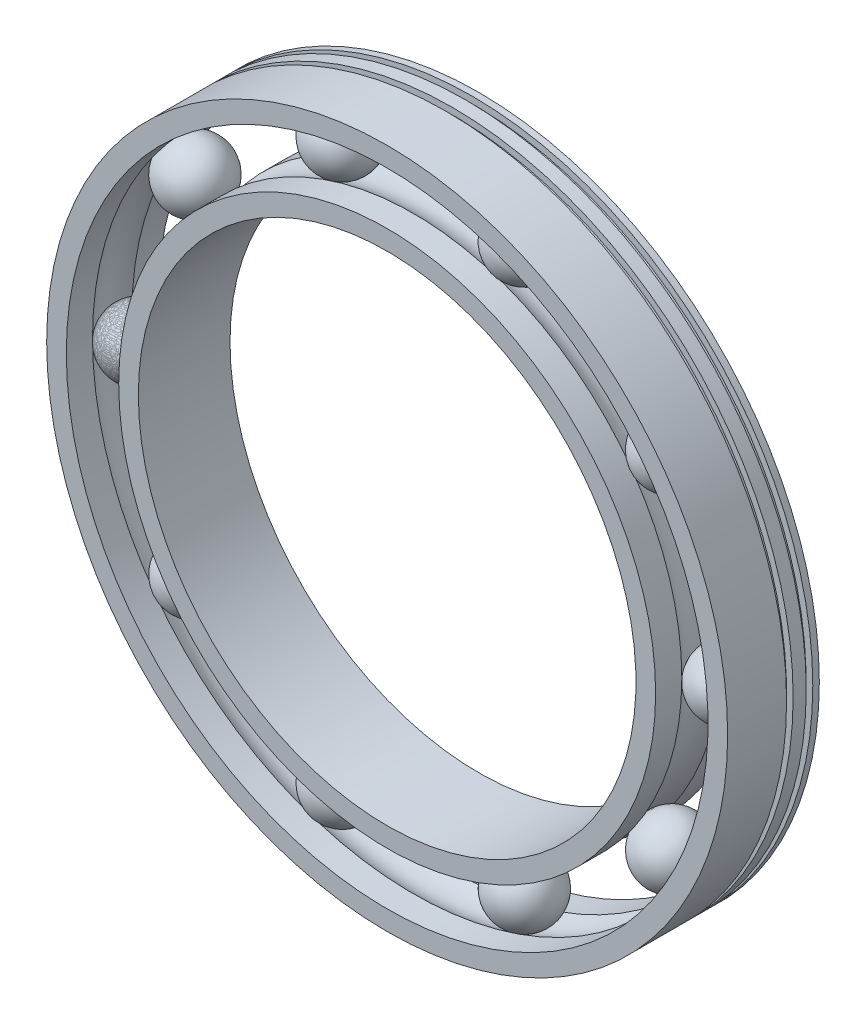
ISO-10303-21;
HEADER;
FILE_DESCRIPTION(('STEP AP214'),'2;1');
FILE_NAME('part.step','',(''),(''),'','','');
FILE_SCHEMA(('AUTOMOTIVE_DESIGN { 1 0 10303 214 1 1 1 1 }'));
ENDSEC;
DATA;
#1=APPLICATION_CONTEXT('core data for automotive mechanical design processes');
#2=APPLICATION_PROTOCOL_DEFINITION('international standard','automotive_design',2000,#1);
#3=PRODUCT_CONTEXT('',#1,'mechanical');
#4=PRODUCT('Part','Part','',(#3));
#5=PRODUCT_RELATED_PRODUCT_CATEGORY('part','',(#4));
#6=PRODUCT_DEFINITION_FORMATION('','',#4);
#7=PRODUCT_DEFINITION_CONTEXT('part definition',#1,'design');
#8=PRODUCT_DEFINITION('design','',#6,#7);
#9=PRODUCT_DEFINITION_SHAPE('','',#8);
#10=(LENGTH_UNIT() NAMED_UNIT(*) SI_UNIT(.MILLI.,.METRE.));
#11=(NAMED_UNIT(*) PLANE_ANGLE_UNIT() SI_UNIT($,.RADIAN.));
#12=(NAMED_UNIT(*) SI_UNIT($,.STERADIAN.) SOLID_ANGLE_UNIT());
#13=UNCERTAINTY_MEASURE_WITH_UNIT(LENGTH_MEASURE(1.E-05),#10,'distance_accuracy_value','');
#14=(GEOMETRIC_REPRESENTATION_CONTEXT(3) GLOBAL_UNCERTAINTY_ASSIGNED_CONTEXT((#13)) GLOBAL_UNIT_ASSIGNED_CONTEXT((#10,
#11,#12)) REPRESENTATION_CONTEXT('',''));
#15=CARTESIAN_POINT('',(0.,0.,0.));
#16=DIRECTION('',(0.,0.,1.));
#17=DIRECTION('',(1.,0.,0.));
#18=AXIS2_PLACEMENT_3D('',#15,#16,#17);
#19=CARTESIAN_POINT('',(-36.405764746873,-26.4503363531608,0.));
#20=DIRECTION('',(0.47552825814757,-0.654508497187483,0.587785252292469));
#21=DIRECTION('',(0.809016994374955,0.587785252292462,0.));
#22=AXIS2_PLACEMENT_3D('',#19,#20,#21);
#23=SPHERICAL_SURFACE('',#22,5.);
#24=CARTESIAN_POINT('',(-34.0281234561351,-29.7228788390982,2.93892626146234));
#25=VERTEX_POINT('',#24);
#26=VERTEX_LOOP('',#25);
#27=FACE_BOUND('',#26,.T.);
#28=ADVANCED_FACE('F39',(#27),#23,.T.);
#29=CLOSED_SHELL('',(#28));
#30=MANIFOLD_SOLID_BREP('B2',#29);
#31=CARTESIAN_POINT('',(-13.9057647468731,-42.7975432332818,0.));
#32=DIRECTION('',(0.769420884293814,-0.25000000000001,0.587785252292469));
#33=DIRECTION('',(0.309016994374958,0.95105651629515,0.));
#34=AXIS2_PLACEMENT_3D('',#31,#32,#33);
#35=SPHERICAL_SURFACE('',#34,5.);
#36=CARTESIAN_POINT('',(-10.0586603254041,-44.0475432332818,2.93892626146234));
#37=VERTEX_POINT('',#36);
#38=VERTEX_LOOP('',#37);
#39=FACE_BOUND('',#38,.T.);
#40=ADVANCED_FACE('F57',(#39),#35,.T.);
#41=CLOSED_SHELL('',(#40));
#42=MANIFOLD_SOLID_BREP('B6',#41);
#43=CARTESIAN_POINT('',(13.9057647468722,-42.797543233282,0.));
#44=DIRECTION('',(0.769420884293819,0.249999999999993,0.587785252292469));
#45=DIRECTION('',(-0.309016994374938,0.951056516295157,0.));
#46=AXIS2_PLACEMENT_3D('',#43,#44,#45);
#47=SPHERICAL_SURFACE('',#46,5.);
#48=CARTESIAN_POINT('',(17.7528691683413,-41.5475432332821,2.93892626146234));
#49=VERTEX_POINT('',#48);
#50=VERTEX_LOOP('',#49);
#51=FACE_BOUND('',#50,.T.);
#52=ADVANCED_FACE('F75',(#51),#47,.T.);
#53=CLOSED_SHELL('',(#52));
#54=MANIFOLD_SOLID_BREP('B35',#53);
#55=CARTESIAN_POINT('',(36.4057647468724,-26.4503363531616,0.));
#56=DIRECTION('',(0.475528258147585,0.654508497187472,0.587785252292469));
#57=DIRECTION('',(-0.809016994374942,0.58778525229248,0.));
#58=AXIS2_PLACEMENT_3D('',#55,#56,#57);
#59=SPHERICAL_SURFACE('',#58,5.);
#60=CARTESIAN_POINT('',(38.7834060376103,-23.1777938672242,2.93892626146234));
#61=VERTEX_POINT('',#60);
#62=VERTEX_LOOP('',#61);
#63=FACE_BOUND('',#62,.T.);
#64=ADVANCED_FACE('F93',(#63),#59,.T.);
#65=CLOSED_SHELL('',(#64));
#66=MANIFOLD_SOLID_BREP('B53',#65);
#67=CARTESIAN_POINT('',(45.,0.,0.));
#68=DIRECTION('',(0.,0.809016994374951,0.587785252292469));
#69=DIRECTION('',(-1.,0.,0.));
#70=AXIS2_PLACEMENT_3D('',#67,#68,#69);
#71=SPHERICAL_SURFACE('',#70,5.);
#72=CARTESIAN_POINT('',(45.,4.04508497187475,2.93892626146234));
#73=VERTEX_POINT('',#72);
#74=VERTEX_LOOP('',#73);
#75=FACE_BOUND('',#74,.T.);
#76=ADVANCED_FACE('F111',(#75),#71,.T.);
#77=CLOSED_SHELL('',(#76));
#78=MANIFOLD_SOLID_BREP('B71',#77);
#79=CARTESIAN_POINT('',(36.4057647468728,26.4503363531611,0.));
#80=DIRECTION('',(-0.475528258147575,0.654508497187479,0.587785252292469));
#81=DIRECTION('',(-0.809016994374951,-0.587785252292468,0.));
#82=AXIS2_PLACEMENT_3D('',#79,#80,#81);
#83=SPHERICAL_SURFACE('',#82,5.);
#84=CARTESIAN_POINT('',(34.0281234561349,29.7228788390985,2.93892626146234));
#85=VERTEX_POINT('',#84);
#86=VERTEX_LOOP('',#85);
#87=FACE_BOUND('',#86,.T.);
#88=ADVANCED_FACE('F129',(#87),#83,.T.);
#89=CLOSED_SHELL('',(#88));
#90=MANIFOLD_SOLID_BREP('B89',#89);
#91=CARTESIAN_POINT('',(13.9057647468728,42.7975432332819,0.));
#92=DIRECTION('',(-0.769420884293815,0.250000000000005,0.587785252292469));
#93=DIRECTION('',(-0.309016994374952,-0.951056516295152,0.));
#94=AXIS2_PLACEMENT_3D('',#91,#92,#93);
#95=SPHERICAL_SURFACE('',#94,5.);
#96=CARTESIAN_POINT('',(10.0586603254037,44.0475432332819,2.93892626146234));
#97=VERTEX_POINT('',#96);
#98=VERTEX_LOOP('',#97);
#99=FACE_BOUND('',#98,.T.);
#100=ADVANCED_FACE('F147',(#99),#95,.T.);
#101=CLOSED_SHELL('',(#100));
#102=MANIFOLD_SOLID_BREP('B107',#101);
#103=CARTESIAN_POINT('',(-13.9057647468725,42.797543233282,0.));
#104=DIRECTION('',(-0.769420884293817,-0.249999999999999,0.587785252292469));
#105=DIRECTION('',(0.309016994374945,-0.951056516295155,0.));
#106=AXIS2_PLACEMENT_3D('',#103,#104,#105);
#107=SPHERICAL_SURFACE('',#106,5.);
#108=CARTESIAN_POINT('',(-17.7528691683416,41.547543233282,2.93892626146234));
#109=VERTEX_POINT('',#108);
#110=VERTEX_LOOP('',#109);
#111=FACE_BOUND('',#110,.T.);
#112=ADVANCED_FACE('F165',(#111),#107,.T.);
#113=CLOSED_SHELL('',(#112));
#114=MANIFOLD_SOLID_BREP('B125',#113);
#115=CARTESIAN_POINT('',(-36.4057647468726,26.4503363531613,0.));
#116=DIRECTION('',(-0.47552825814758,-0.654508497187476,0.587785252292469));
#117=DIRECTION('',(0.809016994374947,-0.587785252292474,0.));
#118=AXIS2_PLACEMENT_3D('',#115,#116,#117);
#119=SPHERICAL_SURFACE('',#118,5.);
#120=CARTESIAN_POINT('',(-38.7834060376105,23.177793867224,2.93892626146234));
#121=VERTEX_POINT('',#120);
#122=VERTEX_LOOP('',#121);
#123=FACE_BOUND('',#122,.T.);
#124=ADVANCED_FACE('F183',(#123),#119,.T.);
#125=CLOSED_SHELL('',(#124));
#126=MANIFOLD_SOLID_BREP('B143',#125);
#127=CARTESIAN_POINT('',(-45.,0.,0.));
#128=DIRECTION('',(0.,0.809016994374955,-0.587785252292462));
#129=DIRECTION('',(1.,0.,0.));
#130=AXIS2_PLACEMENT_3D('',#127,#128,#129);
#131=SPHERICAL_SURFACE('',#130,5.);
#132=CARTESIAN_POINT('',(-45.,4.04508497187478,-2.93892626146231));
#133=VERTEX_POINT('',#132);
#134=VERTEX_LOOP('',#133);
#135=FACE_BOUND('',#134,.T.);
#136=ADVANCED_FACE('F201',(#135),#131,.T.);
#137=CLOSED_SHELL('',(#136));
#138=MANIFOLD_SOLID_BREP('B161',#137);
#139=CARTESIAN_POINT('',(-45.,0.,0.));
#140=DIRECTION('',(0.,0.309016994374958,-0.95105651629515));
#141=DIRECTION('',(1.,0.,0.));
#142=AXIS2_PLACEMENT_3D('',#139,#140,#141);
#143=SPHERICAL_SURFACE('',#142,5.);
#144=CARTESIAN_POINT('',(-45.,1.54508497187479,-4.75528258147575));
#145=VERTEX_POINT('',#144);
#146=VERTEX_LOOP('',#145);
#147=FACE_BOUND('',#146,.T.);
#148=ADVANCED_FACE('F219',(#147),#143,.T.);
#149=CLOSED_SHELL('',(#148));
#150=MANIFOLD_SOLID_BREP('B179',#149);
#151=CARTESIAN_POINT('',(-45.,0.,0.));
#152=DIRECTION('',(0.,-0.309016994374938,-0.951056516295157));
#153=DIRECTION('',(1.,0.,0.));
#154=AXIS2_PLACEMENT_3D('',#151,#152,#153);
#155=SPHERICAL_SURFACE('',#154,5.);
#156=CARTESIAN_POINT('',(-45.,-1.54508497187469,-4.75528258147578));
#157=VERTEX_POINT('',#156);
#158=VERTEX_LOOP('',#157);
#159=FACE_BOUND('',#158,.T.);
#160=ADVANCED_FACE('F237',(#159),#155,.T.);
#161=CLOSED_SHELL('',(#160));
#162=MANIFOLD_SOLID_BREP('B197',#161);
#163=CARTESIAN_POINT('',(-45.,0.,0.));
#164=DIRECTION('',(0.,-0.809016994374942,-0.58778525229248));
#165=DIRECTION('',(1.,0.,0.));
#166=AXIS2_PLACEMENT_3D('',#163,#164,#165);
#167=SPHERICAL_SURFACE('',#166,5.);
#168=CARTESIAN_POINT('',(-45.,-4.04508497187471,-2.9389262614624));
#169=VERTEX_POINT('',#168);
#170=VERTEX_LOOP('',#169);
#171=FACE_BOUND('',#170,.T.);
#172=ADVANCED_FACE('F255',(#171),#167,.T.);
#173=CLOSED_SHELL('',(#172));
#174=MANIFOLD_SOLID_BREP('B215',#173);
#175=CARTESIAN_POINT('',(-45.,0.,0.));
#176=DIRECTION('',(0.,-1.,0.));
#177=DIRECTION('',(1.,0.,0.));
#178=AXIS2_PLACEMENT_3D('',#175,#176,#177);
#179=SPHERICAL_SURFACE('',#178,5.);
#180=CARTESIAN_POINT('',(-45.,-5.,0.));
#181=VERTEX_POINT('',#180);
#182=VERTEX_LOOP('',#181);
#183=FACE_BOUND('',#182,.T.);
#184=ADVANCED_FACE('F273',(#183),#179,.T.);
#185=CLOSED_SHELL('',(#184));
#186=MANIFOLD_SOLID_BREP('B233',#185);
#187=CARTESIAN_POINT('',(-45.,0.,0.));
#188=DIRECTION('',(0.,-0.809016994374951,0.587785252292469));
#189=DIRECTION('',(1.,0.,0.));
#190=AXIS2_PLACEMENT_3D('',#187,#188,#189);
#191=SPHERICAL_SURFACE('',#190,5.);
#192=CARTESIAN_POINT('',(-45.,-4.04508497187475,2.93892626146234));
#193=VERTEX_POINT('',#192);
#194=VERTEX_LOOP('',#193);
#195=FACE_BOUND('',#194,.T.);
#196=ADVANCED_FACE('F291',(#195),#191,.T.);
#197=CLOSED_SHELL('',(#196));
#198=MANIFOLD_SOLID_BREP('B251',#197);
#199=CARTESIAN_POINT('',(-45.,0.,0.));
#200=DIRECTION('',(0.,-0.309016994374952,0.951056516295152));
#201=DIRECTION('',(1.,0.,0.));
#202=AXIS2_PLACEMENT_3D('',#199,#200,#201);
#203=SPHERICAL_SURFACE('',#202,5.);
#204=CARTESIAN_POINT('',(-45.,-1.54508497187476,4.75528258147576));
#205=VERTEX_POINT('',#204);
#206=VERTEX_LOOP('',#205);
#207=FACE_BOUND('',#206,.T.);
#208=ADVANCED_FACE('F309',(#207),#203,.T.);
#209=CLOSED_SHELL('',(#208));
#210=MANIFOLD_SOLID_BREP('B269',#209);
#211=CARTESIAN_POINT('',(-45.,0.,0.));
#212=DIRECTION('',(0.,0.309016994374945,0.951056516295155));
#213=DIRECTION('',(1.,0.,0.));
#214=AXIS2_PLACEMENT_3D('',#211,#212,#213);
#215=SPHERICAL_SURFACE('',#214,5.);
#216=CARTESIAN_POINT('',(-45.,1.54508497187472,4.75528258147577));
#217=VERTEX_POINT('',#216);
#218=VERTEX_LOOP('',#217);
#219=FACE_BOUND('',#218,.T.);
#220=ADVANCED_FACE('F327',(#219),#215,.T.);
#221=CLOSED_SHELL('',(#220));
#222=MANIFOLD_SOLID_BREP('B287',#221);
#223=CARTESIAN_POINT('',(-45.,0.,0.));
#224=DIRECTION('',(0.,0.809016994374947,0.587785252292474));
#225=DIRECTION('',(1.,0.,0.));
#226=AXIS2_PLACEMENT_3D('',#223,#224,#225);
#227=SPHERICAL_SURFACE('',#226,5.);
#228=CARTESIAN_POINT('',(-45.,4.04508497187473,2.93892626146237));
#229=VERTEX_POINT('',#228);
#230=VERTEX_LOOP('',#229);
#231=FACE_BOUND('',#230,.T.);
#232=ADVANCED_FACE('F345',(#231),#227,.T.);
#233=CLOSED_SHELL('',(#232));
#234=MANIFOLD_SOLID_BREP('B305',#233);
#235=CARTESIAN_POINT('',(-45.,0.,0.));
#236=DIRECTION('',(0.,1.,0.));
#237=DIRECTION('',(1.,0.,0.));
#238=AXIS2_PLACEMENT_3D('',#235,#236,#237);
#239=SPHERICAL_SURFACE('',#238,5.);
#240=CARTESIAN_POINT('',(-45.,5.,0.));
#241=VERTEX_POINT('',#240);
#242=VERTEX_LOOP('',#241);
#243=FACE_BOUND('',#242,.T.);
#244=ADVANCED_FACE('F365',(#243),#239,.T.);
#245=CLOSED_SHELL('',(#244));
#246=MANIFOLD_SOLID_BREP('B323',#245);
#247=CARTESIAN_POINT('',(-41.0424127225563,0.,7.));
#248=DIRECTION('',(0.,0.,-1.));
#249=DIRECTION('',(-1.,0.,0.));
#250=AXIS2_PLACEMENT_3D('',#247,#248,#249);
#251=PLANE('',#250);
#252=CARTESIAN_POINT('',(-0.0424127225563398,0.,7.));
#253=DIRECTION('',(0.,0.,-1.));
#254=DIRECTION('',(-1.,0.,0.));
#255=AXIS2_PLACEMENT_3D('',#252,#253,#254);
#256=CIRCLE('',#255,41.);
#257=CARTESIAN_POINT('',(-41.0424127225563,0.,7.));
#258=VERTEX_POINT('',#257);
#259=EDGE_CURVE('E364',#258,#258,#256,.T.);
#260=ORIENTED_EDGE('',*,*,#259,.F.);
#261=EDGE_LOOP('',(#260));
#262=FACE_BOUND('',#261,.T.);
#263=CARTESIAN_POINT('',(-0.0424127225563398,0.,7.));
#264=DIRECTION('',(0.,0.,-1.));
#265=DIRECTION('',(-1.,0.,0.));
#266=AXIS2_PLACEMENT_3D('',#263,#264,#265);
#267=CIRCLE('',#266,38.);
#268=CARTESIAN_POINT('',(-38.0424127225563,0.,7.));
#269=VERTEX_POINT('',#268);
#270=EDGE_CURVE('E406',#269,#269,#267,.T.);
#271=ORIENTED_EDGE('',*,*,#270,.T.);
#272=EDGE_LOOP('',(#271));
#273=FACE_BOUND('',#272,.T.);
#274=ADVANCED_FACE('F384',(#262,#273),#251,.F.);
#275=CARTESIAN_POINT('',(-0.0424127225563398,0.,-20.5155244832141));
#276=DIRECTION('',(0.,0.,-1.));
#277=DIRECTION('',(-1.,0.,0.));
#278=AXIS2_PLACEMENT_3D('',#275,#276,#277);
#279=CYLINDRICAL_SURFACE('',#278,41.);
#280=CARTESIAN_POINT('',(-0.0424127225563398,0.,2.99999999999999));
#281=DIRECTION('',(0.,0.,-1.));
#282=DIRECTION('',(-1.,0.,0.));
#283=AXIS2_PLACEMENT_3D('',#280,#281,#282);
#284=CIRCLE('',#283,41.);
#285=CARTESIAN_POINT('',(-41.0424127225563,0.,2.99999999999999));
#286=VERTEX_POINT('',#285);
#287=EDGE_CURVE('E390',#286,#286,#284,.T.);
#288=ORIENTED_EDGE('',*,*,#287,.F.);
#289=EDGE_LOOP('',(#288));
#290=FACE_BOUND('',#289,.T.);
#291=ORIENTED_EDGE('',*,*,#259,.T.);
#292=EDGE_LOOP('',(#291));
#293=FACE_BOUND('',#292,.T.);
#294=ADVANCED_FACE('F431',(#290,#293),#279,.T.);
#295=CARTESIAN_POINT('',(-0.0424127225563398,0.,0.));
#296=DIRECTION('',(0.,0.,-1.));
#297=DIRECTION('',(-1.,0.,0.));
#298=AXIS2_PLACEMENT_3D('',#295,#296,#297);
#299=TOROIDAL_SURFACE('',#298,45.,5.);
#300=CARTESIAN_POINT('',(-0.0424127225563398,0.,-2.99999999999999));
#301=DIRECTION('',(0.,0.,-1.));
#302=DIRECTION('',(-1.,0.,0.));
#303=AXIS2_PLACEMENT_3D('',#300,#301,#302);
#304=CIRCLE('',#303,41.);
#305=CARTESIAN_POINT('',(-41.0424127225563,0.,-2.99999999999999));
#306=VERTEX_POINT('',#305);
#307=EDGE_CURVE('E394',#306,#306,#304,.T.);
#308=ORIENTED_EDGE('',*,*,#307,.F.);
#309=EDGE_LOOP('',(#308));
#310=FACE_BOUND('',#309,.T.);
#311=ORIENTED_EDGE('',*,*,#287,.T.);
#312=EDGE_LOOP('',(#311));
#313=FACE_BOUND('',#312,.T.);
#314=ADVANCED_FACE('F426',(#310,#313),#299,.F.);
#315=CARTESIAN_POINT('',(-0.0424127225563398,0.,-20.5155244832141));
#316=DIRECTION('',(0.,0.,-1.));
#317=DIRECTION('',(-1.,0.,0.));
#318=AXIS2_PLACEMENT_3D('',#315,#316,#317);
#319=CYLINDRICAL_SURFACE('',#318,41.);
#320=CARTESIAN_POINT('',(-0.0424127225563398,0.,-7.));
#321=DIRECTION('',(0.,0.,-1.));
#322=DIRECTION('',(-1.,0.,0.));
#323=AXIS2_PLACEMENT_3D('',#320,#321,#322);
#324=CIRCLE('',#323,41.);
#325=CARTESIAN_POINT('',(-41.0424127225563,0.,-7.));
#326=VERTEX_POINT('',#325);
#327=EDGE_CURVE('E398',#326,#326,#324,.T.);
#328=ORIENTED_EDGE('',*,*,#327,.F.);
#329=EDGE_LOOP('',(#328));
#330=FACE_BOUND('',#329,.T.);
#331=ORIENTED_EDGE('',*,*,#307,.T.);
#332=EDGE_LOOP('',(#331));
#333=FACE_BOUND('',#332,.T.);
#334=ADVANCED_FACE('F420',(#330,#333),#319,.T.);
#335=CARTESIAN_POINT('',(-41.0424127225563,0.,-7.));
#336=DIRECTION('',(0.,0.,1.));
#337=DIRECTION('',(1.,0.,0.));
#338=AXIS2_PLACEMENT_3D('',#335,#336,#337);
#339=PLANE('',#338);
#340=CARTESIAN_POINT('',(-0.0424127225563398,0.,-7.));
#341=DIRECTION('',(0.,0.,-1.));
#342=DIRECTION('',(-1.,0.,0.));
#343=AXIS2_PLACEMENT_3D('',#340,#341,#342);
#344=CIRCLE('',#343,38.);
#345=CARTESIAN_POINT('',(-38.0424127225563,0.,-7.));
#346=VERTEX_POINT('',#345);
#347=EDGE_CURVE('E403',#346,#346,#344,.T.);
#348=ORIENTED_EDGE('',*,*,#347,.F.);
#349=EDGE_LOOP('',(#348));
#350=FACE_BOUND('',#349,.T.);
#351=ORIENTED_EDGE('',*,*,#327,.T.);
#352=EDGE_LOOP('',(#351));
#353=FACE_BOUND('',#352,.T.);
#354=ADVANCED_FACE('F414',(#350,#353),#339,.F.);
#355=CARTESIAN_POINT('',(-0.0424127225563398,0.,-20.5155244832141));
#356=DIRECTION('',(0.,0.,-1.));
#357=DIRECTION('',(-1.,0.,0.));
#358=AXIS2_PLACEMENT_3D('',#355,#356,#357);
#359=CYLINDRICAL_SURFACE('',#358,38.);
#360=ORIENTED_EDGE('',*,*,#270,.F.);
#361=EDGE_LOOP('',(#360));
#362=FACE_BOUND('',#361,.T.);
#363=ORIENTED_EDGE('',*,*,#347,.T.);
#364=EDGE_LOOP('',(#363));
#365=FACE_BOUND('',#364,.T.);
#366=ADVANCED_FACE('F411',(#362,#365),#359,.F.);
#367=CLOSED_SHELL('',(#274,#294,#314,#334,#354,#366));
#368=MANIFOLD_SOLID_BREP('B341',#367);
#369=CARTESIAN_POINT('',(-0.0424127225563398,0.,0.));
#370=DIRECTION('',(0.,0.,-1.));
#371=DIRECTION('',(-1.,0.,0.));
#372=AXIS2_PLACEMENT_3D('',#369,#370,#371);
#373=TOROIDAL_SURFACE('',#372,45.,5.);
#374=CARTESIAN_POINT('',(-0.0424127225563398,0.,2.99999999999998));
#375=DIRECTION('',(0.,0.,-1.));
#376=DIRECTION('',(-1.,0.,0.));
#377=AXIS2_PLACEMENT_3D('',#374,#375,#376);
#378=CIRCLE('',#377,49.);
#379=CARTESIAN_POINT('',(-49.0424127225563,0.,2.99999999999998));
#380=VERTEX_POINT('',#379);
#381=EDGE_CURVE('E383',#380,#380,#378,.T.);
#382=ORIENTED_EDGE('',*,*,#381,.F.);
#383=EDGE_LOOP('',(#382));
#384=FACE_BOUND('',#383,.T.);
#385=CARTESIAN_POINT('',(-0.0424127225563398,0.,-2.99999999999998));
#386=DIRECTION('',(0.,0.,-1.));
#387=DIRECTION('',(-1.,0.,0.));
#388=AXIS2_PLACEMENT_3D('',#385,#386,#387);
#389=CIRCLE('',#388,49.);
#390=CARTESIAN_POINT('',(-49.0424127225563,0.,-2.99999999999998));
#391=VERTEX_POINT('',#390);
#392=EDGE_CURVE('E521',#391,#391,#389,.T.);
#393=ORIENTED_EDGE('',*,*,#392,.T.);
#394=EDGE_LOOP('',(#393));
#395=FACE_BOUND('',#394,.T.);
#396=ADVANCED_FACE('F475',(#384,#395),#373,.F.);
#397=CARTESIAN_POINT('',(-0.0424127225563398,0.,-20.5155244832141));
#398=DIRECTION('',(0.,0.,-1.));
#399=DIRECTION('',(-1.,0.,0.));
#400=AXIS2_PLACEMENT_3D('',#397,#398,#399);
#401=CYLINDRICAL_SURFACE('',#400,49.);
#402=CARTESIAN_POINT('',(-0.0424127225563398,0.,7.));
#403=DIRECTION('',(0.,0.,-1.));
#404=DIRECTION('',(-1.,0.,0.));
#405=AXIS2_PLACEMENT_3D('',#402,#403,#404);
#406=CIRCLE('',#405,49.);
#407=CARTESIAN_POINT('',(-49.0424127225563,0.,7.));
#408=VERTEX_POINT('',#407);
#409=EDGE_CURVE('E481',#408,#408,#406,.T.);
#410=ORIENTED_EDGE('',*,*,#409,.F.);
#411=EDGE_LOOP('',(#410));
#412=FACE_BOUND('',#411,.T.);
#413=ORIENTED_EDGE('',*,*,#381,.T.);
#414=EDGE_LOOP('',(#413));
#415=FACE_BOUND('',#414,.T.);
#416=ADVANCED_FACE('F594',(#412,#415),#401,.F.);
#417=CARTESIAN_POINT('',(-52.0424127225563,0.,7.));
#418=DIRECTION('',(0.,0.,-1.));
#419=DIRECTION('',(-1.,0.,0.));
#420=AXIS2_PLACEMENT_3D('',#417,#418,#419);
#421=PLANE('',#420);
#422=CARTESIAN_POINT('',(-0.0424127225563398,0.,7.));
#423=DIRECTION('',(0.,0.,-1.));
#424=DIRECTION('',(-1.,0.,0.));
#425=AXIS2_PLACEMENT_3D('',#422,#423,#424);
#426=CIRCLE('',#425,52.);
#427=CARTESIAN_POINT('',(-52.0424127225563,0.,7.));
#428=VERTEX_POINT('',#427);
#429=EDGE_CURVE('E485',#428,#428,#426,.T.);
#430=ORIENTED_EDGE('',*,*,#429,.F.);
#431=EDGE_LOOP('',(#430));
#432=FACE_BOUND('',#431,.T.);
#433=ORIENTED_EDGE('',*,*,#409,.T.);
#434=EDGE_LOOP('',(#433));
#435=FACE_BOUND('',#434,.T.);
#436=ADVANCED_FACE('F589',(#432,#435),#421,.F.);
#437=CARTESIAN_POINT('',(-0.0424127225563398,0.,-20.5155244832141));
#438=DIRECTION('',(0.,0.,-1.));
#439=DIRECTION('',(-1.,0.,0.));
#440=AXIS2_PLACEMENT_3D('',#437,#438,#439);
#441=CYLINDRICAL_SURFACE('',#440,52.);
#442=CARTESIAN_POINT('',(-0.0424127225563398,0.,-2.));
#443=DIRECTION('',(0.,0.,-1.));
#444=DIRECTION('',(-1.,0.,0.));
#445=AXIS2_PLACEMENT_3D('',#442,#443,#444);
#446=CIRCLE('',#445,52.);
#447=CARTESIAN_POINT('',(-52.0424127225563,0.,-2.));
#448=VERTEX_POINT('',#447);
#449=EDGE_CURVE('E489',#448,#448,#446,.T.);
#450=ORIENTED_EDGE('',*,*,#449,.F.);
#451=EDGE_LOOP('',(#450));
#452=FACE_BOUND('',#451,.T.);
#453=ORIENTED_EDGE('',*,*,#429,.T.);
#454=EDGE_LOOP('',(#453));
#455=FACE_BOUND('',#454,.T.);
#456=ADVANCED_FACE('F583',(#452,#455),#441,.T.);
#457=CARTESIAN_POINT('',(-51.0424127225563,0.,-2.));
#458=DIRECTION('',(0.,0.,1.));
#459=DIRECTION('',(1.,0.,0.));
#460=AXIS2_PLACEMENT_3D('',#457,#458,#459);
#461=PLANE('',#460);
#462=CARTESIAN_POINT('',(-0.0424127225563398,0.,-2.));
#463=DIRECTION('',(0.,0.,-1.));
#464=DIRECTION('',(-1.,0.,0.));
#465=AXIS2_PLACEMENT_3D('',#462,#463,#464);
#466=CIRCLE('',#465,51.);
#467=CARTESIAN_POINT('',(-51.0424127225563,0.,-2.));
#468=VERTEX_POINT('',#467);
#469=EDGE_CURVE('E494',#468,#468,#466,.T.);
#470=ORIENTED_EDGE('',*,*,#469,.F.);
#471=EDGE_LOOP('',(#470));
#472=FACE_BOUND('',#471,.T.);
#473=ORIENTED_EDGE('',*,*,#449,.T.);
#474=EDGE_LOOP('',(#473));
#475=FACE_BOUND('',#474,.T.);
#476=ADVANCED_FACE('F577',(#472,#475),#461,.F.);
#477=CARTESIAN_POINT('',(-0.0424127225563398,0.,-20.5155244832141));
#478=DIRECTION('',(0.,0.,-1.));
#479=DIRECTION('',(-1.,0.,0.));
#480=AXIS2_PLACEMENT_3D('',#477,#478,#479);
#481=CYLINDRICAL_SURFACE('',#480,51.);
#482=CARTESIAN_POINT('',(-0.0424127225563398,0.,-3.));
#483=DIRECTION('',(0.,0.,-1.));
#484=DIRECTION('',(-1.,0.,0.));
#485=AXIS2_PLACEMENT_3D('',#482,#483,#484);
#486=CIRCLE('',#485,51.);
#487=CARTESIAN_POINT('',(-51.0424127225563,0.,-3.));
#488=VERTEX_POINT('',#487);
#489=EDGE_CURVE('E497',#488,#488,#486,.T.);
#490=ORIENTED_EDGE('',*,*,#489,.F.);
#491=EDGE_LOOP('',(#490));
#492=FACE_BOUND('',#491,.T.);
#493=ORIENTED_EDGE('',*,*,#469,.T.);
#494=EDGE_LOOP('',(#493));
#495=FACE_BOUND('',#494,.T.);
#496=ADVANCED_FACE('F571',(#492,#495),#481,.T.);
#497=CARTESIAN_POINT('',(-52.0424127225563,0.,-3.));
#498=DIRECTION('',(0.,0.,-1.));
#499=DIRECTION('',(-1.,0.,0.));
#500=AXIS2_PLACEMENT_3D('',#497,#498,#499);
#501=PLANE('',#500);
#502=CARTESIAN_POINT('',(-0.0424127225563398,0.,-3.));
#503=DIRECTION('',(0.,0.,-1.));
#504=DIRECTION('',(-1.,0.,0.));
#505=AXIS2_PLACEMENT_3D('',#502,#503,#504);
#506=CIRCLE('',#505,52.);
#507=CARTESIAN_POINT('',(-52.0424127225563,0.,-3.));
#508=VERTEX_POINT('',#507);
#509=EDGE_CURVE('E500',#508,#508,#506,.T.);
#510=ORIENTED_EDGE('',*,*,#509,.F.);
#511=EDGE_LOOP('',(#510));
#512=FACE_BOUND('',#511,.T.);
#513=ORIENTED_EDGE('',*,*,#489,.T.);
#514=EDGE_LOOP('',(#513));
#515=FACE_BOUND('',#514,.T.);
#516=ADVANCED_FACE('F565',(#512,#515),#501,.F.);
#517=CARTESIAN_POINT('',(-0.0424127225563398,0.,-20.5155244832141));
#518=DIRECTION('',(0.,0.,-1.));
#519=DIRECTION('',(-1.,0.,0.));
#520=AXIS2_PLACEMENT_3D('',#517,#518,#519);
#521=CYLINDRICAL_SURFACE('',#520,52.);
#522=CARTESIAN_POINT('',(-0.0424127225563398,0.,-5.));
#523=DIRECTION('',(0.,0.,-1.));
#524=DIRECTION('',(-1.,0.,0.));
#525=AXIS2_PLACEMENT_3D('',#522,#523,#524);
#526=CIRCLE('',#525,52.);
#527=CARTESIAN_POINT('',(-52.0424127225563,0.,-5.));
#528=VERTEX_POINT('',#527);
#529=EDGE_CURVE('E503',#528,#528,#526,.T.);
#530=ORIENTED_EDGE('',*,*,#529,.F.);
#531=EDGE_LOOP('',(#530));
#532=FACE_BOUND('',#531,.T.);
#533=ORIENTED_EDGE('',*,*,#509,.T.);
#534=EDGE_LOOP('',(#533));
#535=FACE_BOUND('',#534,.T.);
#536=ADVANCED_FACE('F559',(#532,#535),#521,.T.);
#537=CARTESIAN_POINT('',(-51.0265428847286,0.,-5.));
#538=DIRECTION('',(0.,0.,1.));
#539=DIRECTION('',(1.,0.,0.));
#540=AXIS2_PLACEMENT_3D('',#537,#538,#539);
#541=PLANE('',#540);
#542=CARTESIAN_POINT('',(-0.0424127225563398,0.,-5.));
#543=DIRECTION('',(0.,0.,-1.));
#544=DIRECTION('',(-1.,0.,0.));
#545=AXIS2_PLACEMENT_3D('',#542,#543,#544);
#546=CIRCLE('',#545,50.9841301621722);
#547=CARTESIAN_POINT('',(-51.0265428847286,0.,-5.));
#548=VERTEX_POINT('',#547);
#549=EDGE_CURVE('E506',#548,#548,#546,.T.);
#550=ORIENTED_EDGE('',*,*,#549,.F.);
#551=EDGE_LOOP('',(#550));
#552=FACE_BOUND('',#551,.T.);
#553=ORIENTED_EDGE('',*,*,#529,.T.);
#554=EDGE_LOOP('',(#553));
#555=FACE_BOUND('',#554,.T.);
#556=ADVANCED_FACE('F553',(#552,#555),#541,.F.);
#557=CARTESIAN_POINT('',(-0.0424127225563398,0.,-20.5155244832141));
#558=DIRECTION('',(0.,0.,-1.));
#559=DIRECTION('',(-1.,0.,0.));
#560=AXIS2_PLACEMENT_3D('',#557,#558,#559);
#561=CYLINDRICAL_SURFACE('',#560,50.9841301621722);
#562=CARTESIAN_POINT('',(-0.0424127225563398,0.,-6.));
#563=DIRECTION('',(0.,0.,-1.));
#564=DIRECTION('',(-1.,0.,0.));
#565=AXIS2_PLACEMENT_3D('',#562,#563,#564);
#566=CIRCLE('',#565,50.9841301621722);
#567=CARTESIAN_POINT('',(-51.0265428847286,0.,-6.));
#568=VERTEX_POINT('',#567);
#569=EDGE_CURVE('E509',#568,#568,#566,.T.);
#570=ORIENTED_EDGE('',*,*,#569,.F.);
#571=EDGE_LOOP('',(#570));
#572=FACE_BOUND('',#571,.T.);
#573=ORIENTED_EDGE('',*,*,#549,.T.);
#574=EDGE_LOOP('',(#573));
#575=FACE_BOUND('',#574,.T.);
#576=ADVANCED_FACE('F547',(#572,#575),#561,.T.);
#577=CARTESIAN_POINT('',(-52.0424127225563,0.,-6.));
#578=DIRECTION('',(0.,0.,-1.));
#579=DIRECTION('',(-1.,0.,0.));
#580=AXIS2_PLACEMENT_3D('',#577,#578,#579);
#581=PLANE('',#580);
#582=CARTESIAN_POINT('',(-0.0424127225563398,0.,-6.));
#583=DIRECTION('',(0.,0.,-1.));
#584=DIRECTION('',(-1.,0.,0.));
#585=AXIS2_PLACEMENT_3D('',#582,#583,#584);
#586=CIRCLE('',#585,52.);
#587=CARTESIAN_POINT('',(-52.0424127225563,0.,-6.));
#588=VERTEX_POINT('',#587);
#589=EDGE_CURVE('E512',#588,#588,#586,.T.);
#590=ORIENTED_EDGE('',*,*,#589,.F.);
#591=EDGE_LOOP('',(#590));
#592=FACE_BOUND('',#591,.T.);
#593=ORIENTED_EDGE('',*,*,#569,.T.);
#594=EDGE_LOOP('',(#593));
#595=FACE_BOUND('',#594,.T.);
#596=ADVANCED_FACE('F541',(#592,#595),#581,.F.);
#597=CARTESIAN_POINT('',(-0.0424127225563398,0.,-20.5155244832141));
#598=DIRECTION('',(0.,0.,-1.));
#599=DIRECTION('',(-1.,0.,0.));
#600=AXIS2_PLACEMENT_3D('',#597,#598,#599);
#601=CYLINDRICAL_SURFACE('',#600,52.);
#602=CARTESIAN_POINT('',(-0.0424127225563398,0.,-7.));
#603=DIRECTION('',(0.,0.,-1.));
#604=DIRECTION('',(-1.,0.,0.));
#605=AXIS2_PLACEMENT_3D('',#602,#603,#604);
#606=CIRCLE('',#605,52.);
#607=CARTESIAN_POINT('',(-52.0424127225563,0.,-7.));
#608=VERTEX_POINT('',#607);
#609=EDGE_CURVE('E515',#608,#608,#606,.T.);
#610=ORIENTED_EDGE('',*,*,#609,.F.);
#611=EDGE_LOOP('',(#610));
#612=FACE_BOUND('',#611,.T.);
#613=ORIENTED_EDGE('',*,*,#589,.T.);
#614=EDGE_LOOP('',(#613));
#615=FACE_BOUND('',#614,.T.);
#616=ADVANCED_FACE('F535',(#612,#615),#601,.T.);
#617=CARTESIAN_POINT('',(-52.0424127225563,0.,-7.));
#618=DIRECTION('',(0.,0.,1.));
#619=DIRECTION('',(1.,0.,0.));
#620=AXIS2_PLACEMENT_3D('',#617,#618,#619);
#621=PLANE('',#620);
#622=CARTESIAN_POINT('',(-0.0424127225563398,0.,-7.));
#623=DIRECTION('',(0.,0.,-1.));
#624=DIRECTION('',(-1.,0.,0.));
#625=AXIS2_PLACEMENT_3D('',#622,#623,#624);
#626=CIRCLE('',#625,49.);
#627=CARTESIAN_POINT('',(-49.0424127225563,0.,-7.));
#628=VERTEX_POINT('',#627);
#629=EDGE_CURVE('E518',#628,#628,#626,.T.);
#630=ORIENTED_EDGE('',*,*,#629,.F.);
#631=EDGE_LOOP('',(#630));
#632=FACE_BOUND('',#631,.T.);
#633=ORIENTED_EDGE('',*,*,#609,.T.);
#634=EDGE_LOOP('',(#633));
#635=FACE_BOUND('',#634,.T.);
#636=ADVANCED_FACE('F529',(#632,#635),#621,.F.);
#637=CARTESIAN_POINT('',(-0.0424127225563398,0.,-20.5155244832141));
#638=DIRECTION('',(0.,0.,-1.));
#639=DIRECTION('',(-1.,0.,0.));
#640=AXIS2_PLACEMENT_3D('',#637,#638,#639);
#641=CYLINDRICAL_SURFACE('',#640,49.);
#642=ORIENTED_EDGE('',*,*,#392,.F.);
#643=EDGE_LOOP('',(#642));
#644=FACE_BOUND('',#643,.T.);
#645=ORIENTED_EDGE('',*,*,#629,.T.);
#646=EDGE_LOOP('',(#645));
#647=FACE_BOUND('',#646,.T.);
#648=ADVANCED_FACE('F526',(#644,#647),#641,.F.);
#649=CLOSED_SHELL('',(#396,#416,#436,#456,#476,#496,#516,#536,#556,#576,#596,#616,#636,#648));
#650=MANIFOLD_SOLID_BREP('B359',#649);
#651=ADVANCED_BREP_SHAPE_REPRESENTATION('',(#18,#30,#42,#54,#66,#78,#90,#102,#114,#126,#138,
#150,#162,#174,#186,#198,#210,#222,#234,#246,#368,#650),#14);
#652=SHAPE_DEFINITION_REPRESENTATION(#9,#651);
ENDSEC;
END-ISO-10303-21;
